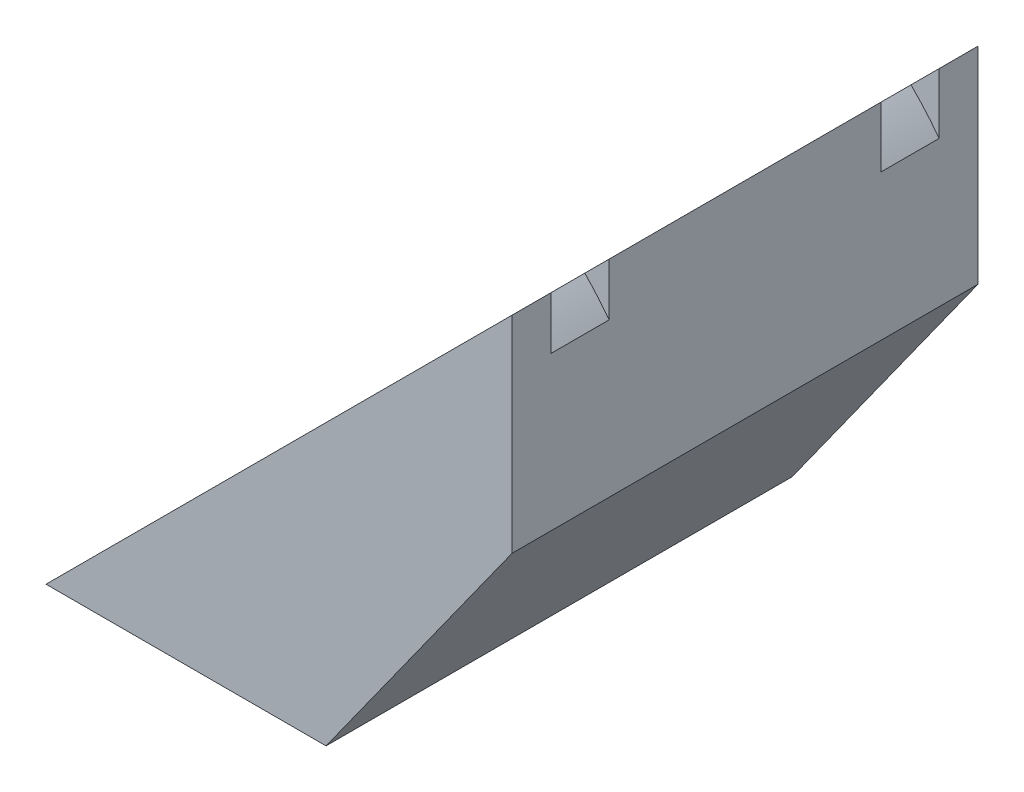
ISO-10303-21;
HEADER;
FILE_DESCRIPTION(('STEP AP214'),'2;1');
FILE_NAME('part.step','',(''),(''),'','','');
FILE_SCHEMA(('AUTOMOTIVE_DESIGN { 1 0 10303 214 1 1 1 1 }'));
ENDSEC;
DATA;
#1=APPLICATION_CONTEXT('core data for automotive mechanical design processes');
#2=APPLICATION_PROTOCOL_DEFINITION('international standard','automotive_design',2000,#1);
#3=PRODUCT_CONTEXT('',#1,'mechanical');
#4=PRODUCT('Part','Part','',(#3));
#5=PRODUCT_RELATED_PRODUCT_CATEGORY('part','',(#4));
#6=PRODUCT_DEFINITION_FORMATION('','',#4);
#7=PRODUCT_DEFINITION_CONTEXT('part definition',#1,'design');
#8=PRODUCT_DEFINITION('design','',#6,#7);
#9=PRODUCT_DEFINITION_SHAPE('','',#8);
#10=(LENGTH_UNIT() NAMED_UNIT(*) SI_UNIT(.MILLI.,.METRE.));
#11=(NAMED_UNIT(*) PLANE_ANGLE_UNIT() SI_UNIT($,.RADIAN.));
#12=(NAMED_UNIT(*) SI_UNIT($,.STERADIAN.) SOLID_ANGLE_UNIT());
#13=UNCERTAINTY_MEASURE_WITH_UNIT(LENGTH_MEASURE(1.E-05),#10,'distance_accuracy_value','');
#14=(GEOMETRIC_REPRESENTATION_CONTEXT(3) GLOBAL_UNCERTAINTY_ASSIGNED_CONTEXT((#13)) GLOBAL_UNIT_ASSIGNED_CONTEXT((#10,
#11,#12)) REPRESENTATION_CONTEXT('',''));
#15=CARTESIAN_POINT('',(0.,0.,0.));
#16=DIRECTION('',(0.,0.,1.));
#17=DIRECTION('',(1.,0.,0.));
#18=AXIS2_PLACEMENT_3D('',#15,#16,#17);
#19=CARTESIAN_POINT('',(12.,24.,-12.));
#20=DIRECTION('',(-1.,0.,0.));
#21=DIRECTION('',(0.,0.,1.));
#22=AXIS2_PLACEMENT_3D('',#19,#20,#21);
#23=PLANE('',#22);
#24=DIRECTION('',(0.,0.,1.));
#25=VECTOR('',#24,1.);
#26=CARTESIAN_POINT('',(12.,13.377330609492,-12.));
#27=LINE('',#26,#25);
#28=CARTESIAN_POINT('',(12.,13.377330609492,-12.));
#29=VERTEX_POINT('',#28);
#30=CARTESIAN_POINT('',(12.,13.377330609492,12.));
#31=VERTEX_POINT('',#30);
#32=EDGE_CURVE('E48',#29,#31,#27,.T.);
#33=ORIENTED_EDGE('',*,*,#32,.F.);
#34=DIRECTION('',(0.,-1.,0.));
#35=VECTOR('',#34,1.);
#36=CARTESIAN_POINT('',(12.,24.,-12.));
#37=LINE('',#36,#35);
#38=CARTESIAN_POINT('',(12.,24.,-12.));
#39=VERTEX_POINT('',#38);
#40=EDGE_CURVE('E250',#39,#29,#37,.T.);
#41=ORIENTED_EDGE('',*,*,#40,.F.);
#42=DIRECTION('',(0.,0.,-1.));
#43=VECTOR('',#42,1.);
#44=CARTESIAN_POINT('',(12.,24.,-12.));
#45=LINE('',#44,#43);
#46=CARTESIAN_POINT('',(12.,24.,-10.));
#47=VERTEX_POINT('',#46);
#48=EDGE_CURVE('E236',#47,#39,#45,.T.);
#49=ORIENTED_EDGE('',*,*,#48,.F.);
#50=DIRECTION('',(0.,1.,0.));
#51=VECTOR('',#50,1.);
#52=CARTESIAN_POINT('',(12.,24.,-10.));
#53=LINE('',#52,#51);
#54=CARTESIAN_POINT('',(12.,20.8850102409347,-10.));
#55=VERTEX_POINT('',#54);
#56=EDGE_CURVE('E373',#55,#47,#53,.T.);
#57=ORIENTED_EDGE('',*,*,#56,.F.);
#58=DIRECTION('',(0.,0.,-1.));
#59=VECTOR('',#58,1.);
#60=CARTESIAN_POINT('',(12.,20.8850102409347,-7.));
#61=LINE('',#60,#59);
#62=CARTESIAN_POINT('',(12.,20.8850102409347,-7.));
#63=VERTEX_POINT('',#62);
#64=EDGE_CURVE('E363',#55,#63,#61,.F.);
#65=ORIENTED_EDGE('',*,*,#64,.T.);
#66=DIRECTION('',(0.,1.,0.));
#67=VECTOR('',#66,1.);
#68=CARTESIAN_POINT('',(12.,24.,-7.));
#69=LINE('',#68,#67);
#70=CARTESIAN_POINT('',(12.,24.,-7.));
#71=VERTEX_POINT('',#70);
#72=EDGE_CURVE('E361',#63,#71,#69,.T.);
#73=ORIENTED_EDGE('',*,*,#72,.T.);
#74=CARTESIAN_POINT('',(12.,24.,7.));
#75=VERTEX_POINT('',#74);
#76=EDGE_CURVE('E239',#75,#71,#45,.T.);
#77=ORIENTED_EDGE('',*,*,#76,.F.);
#78=DIRECTION('',(0.,1.,0.));
#79=VECTOR('',#78,1.);
#80=CARTESIAN_POINT('',(12.,24.,7.));
#81=LINE('',#80,#79);
#82=CARTESIAN_POINT('',(12.,21.2889293337778,7.));
#83=VERTEX_POINT('',#82);
#84=EDGE_CURVE('E359',#83,#75,#81,.T.);
#85=ORIENTED_EDGE('',*,*,#84,.F.);
#86=DIRECTION('',(0.,0.,1.));
#87=VECTOR('',#86,1.);
#88=CARTESIAN_POINT('',(12.,21.2889293337778,7.));
#89=LINE('',#88,#87);
#90=CARTESIAN_POINT('',(12.,21.2889293337778,10.));
#91=VERTEX_POINT('',#90);
#92=EDGE_CURVE('E385',#91,#83,#89,.F.);
#93=ORIENTED_EDGE('',*,*,#92,.F.);
#94=DIRECTION('',(0.,1.,0.));
#95=VECTOR('',#94,1.);
#96=CARTESIAN_POINT('',(12.,24.,10.));
#97=LINE('',#96,#95);
#98=CARTESIAN_POINT('',(12.,24.,10.));
#99=VERTEX_POINT('',#98);
#100=EDGE_CURVE('E387',#91,#99,#97,.T.);
#101=ORIENTED_EDGE('',*,*,#100,.T.);
#102=CARTESIAN_POINT('',(12.,24.,12.));
#103=VERTEX_POINT('',#102);
#104=EDGE_CURVE('E241',#103,#99,#45,.T.);
#105=ORIENTED_EDGE('',*,*,#104,.F.);
#106=DIRECTION('',(0.,-1.,0.));
#107=VECTOR('',#106,1.);
#108=CARTESIAN_POINT('',(12.,24.,12.));
#109=LINE('',#108,#107);
#110=EDGE_CURVE('E248',#103,#31,#109,.T.);
#111=ORIENTED_EDGE('',*,*,#110,.T.);
#112=EDGE_LOOP('',(#33,#41,#49,#57,#65,#73,#77,#85,#93,#101,#105,#111));
#113=FACE_BOUND('',#112,.T.);
#114=ADVANCED_FACE('F35',(#113),#23,.F.);
#115=CARTESIAN_POINT('',(0.,0.,0.));
#116=DIRECTION('',(0.,1.,0.));
#117=DIRECTION('',(0.,0.,1.));
#118=AXIS2_PLACEMENT_3D('',#115,#116,#117);
#119=PLANE('',#118);
#120=DIRECTION('',(-1.,0.,0.));
#121=VECTOR('',#120,1.);
#122=CARTESIAN_POINT('',(0.,0.,4.03680359312908));
#123=LINE('',#122,#121);
#124=CARTESIAN_POINT('',(0.1,0.,4.03680359312908));
#125=VERTEX_POINT('',#124);
#126=CARTESIAN_POINT('',(-0.1,0.,4.03680359312908));
#127=VERTEX_POINT('',#126);
#128=EDGE_CURVE('E42',#125,#127,#123,.T.);
#129=ORIENTED_EDGE('',*,*,#128,.F.);
#130=DIRECTION('',(0.,0.,-1.));
#131=VECTOR('',#130,1.);
#132=CARTESIAN_POINT('',(0.1,0.,0.));
#133=LINE('',#132,#131);
#134=CARTESIAN_POINT('',(0.1,0.,1.19582607431014));
#135=VERTEX_POINT('',#134);
#136=EDGE_CURVE('E499',#125,#135,#133,.T.);
#137=ORIENTED_EDGE('',*,*,#136,.T.);
#138=CARTESIAN_POINT('',(0.,0.,0.));
#139=DIRECTION('',(0.,1.,0.));
#140=DIRECTION('',(0.,0.,1.));
#141=AXIS2_PLACEMENT_3D('',#138,#139,#140);
#142=CIRCLE('',#141,1.2);
#143=CARTESIAN_POINT('',(0.1,0.,-1.19582607431014));
#144=VERTEX_POINT('',#143);
#145=EDGE_CURVE('E497',#135,#144,#142,.T.);
#146=ORIENTED_EDGE('',*,*,#145,.T.);
#147=CARTESIAN_POINT('',(0.1,0.,-4.03680359312908));
#148=VERTEX_POINT('',#147);
#149=EDGE_CURVE('E305',#144,#148,#133,.T.);
#150=ORIENTED_EDGE('',*,*,#149,.T.);
#151=DIRECTION('',(1.,0.,0.));
#152=VECTOR('',#151,1.);
#153=CARTESIAN_POINT('',(0.,0.,-4.03680359312908));
#154=LINE('',#153,#152);
#155=CARTESIAN_POINT('',(-0.1,0.,-4.03680359312908));
#156=VERTEX_POINT('',#155);
#157=EDGE_CURVE('E278',#156,#148,#154,.T.);
#158=ORIENTED_EDGE('',*,*,#157,.F.);
#159=DIRECTION('',(0.,0.,-1.));
#160=VECTOR('',#159,1.);
#161=CARTESIAN_POINT('',(-0.1,0.,0.));
#162=LINE('',#161,#160);
#163=CARTESIAN_POINT('',(-0.1,0.,-1.19582607431014));
#164=VERTEX_POINT('',#163);
#165=EDGE_CURVE('E304',#164,#156,#162,.T.);
#166=ORIENTED_EDGE('',*,*,#165,.F.);
#167=CARTESIAN_POINT('',(-0.1,0.,1.19582607431014));
#168=VERTEX_POINT('',#167);
#169=EDGE_CURVE('E300',#164,#168,#142,.T.);
#170=ORIENTED_EDGE('',*,*,#169,.T.);
#171=EDGE_CURVE('E56',#127,#168,#162,.T.);
#172=ORIENTED_EDGE('',*,*,#171,.F.);
#173=EDGE_LOOP('',(#129,#137,#146,#150,#158,#166,#170,#172));
#174=FACE_BOUND('',#173,.T.);
#175=DIRECTION('',(0.,0.,-1.));
#176=VECTOR('',#175,1.);
#177=CARTESIAN_POINT('',(2.4226441744241,0.,0.));
#178=LINE('',#177,#176);
#179=CARTESIAN_POINT('',(2.4226441744241,0.,12.));
#180=VERTEX_POINT('',#179);
#181=CARTESIAN_POINT('',(2.4226441744241,0.,-12.));
#182=VERTEX_POINT('',#181);
#183=EDGE_CURVE('E218',#180,#182,#178,.T.);
#184=ORIENTED_EDGE('',*,*,#183,.F.);
#185=DIRECTION('',(1.,0.,0.));
#186=VECTOR('',#185,1.);
#187=CARTESIAN_POINT('',(-12.,0.,12.));
#188=LINE('',#187,#186);
#189=CARTESIAN_POINT('',(-12.,0.,12.));
#190=VERTEX_POINT('',#189);
#191=EDGE_CURVE('E229',#190,#180,#188,.T.);
#192=ORIENTED_EDGE('',*,*,#191,.F.);
#193=DIRECTION('',(0.,0.,1.));
#194=VECTOR('',#193,1.);
#195=CARTESIAN_POINT('',(-12.,0.,-12.));
#196=LINE('',#195,#194);
#197=CARTESIAN_POINT('',(-12.,0.,10.));
#198=VERTEX_POINT('',#197);
#199=EDGE_CURVE('E245',#198,#190,#196,.T.);
#200=ORIENTED_EDGE('',*,*,#199,.F.);
#201=DIRECTION('',(1.,0.,0.));
#202=VECTOR('',#201,1.);
#203=CARTESIAN_POINT('',(0.,0.,10.));
#204=LINE('',#203,#202);
#205=CARTESIAN_POINT('',(-8.601291521011,0.,10.));
#206=VERTEX_POINT('',#205);
#207=EDGE_CURVE('E390',#198,#206,#204,.T.);
#208=ORIENTED_EDGE('',*,*,#207,.T.);
#209=DIRECTION('',(0.,0.,1.));
#210=VECTOR('',#209,1.);
#211=CARTESIAN_POINT('',(-8.601291521011,0.,7.));
#212=LINE('',#211,#210);
#213=CARTESIAN_POINT('',(-8.601291521011,0.,7.));
#214=VERTEX_POINT('',#213);
#215=EDGE_CURVE('E379',#214,#206,#212,.T.);
#216=ORIENTED_EDGE('',*,*,#215,.F.);
#217=DIRECTION('',(1.,0.,0.));
#218=VECTOR('',#217,1.);
#219=CARTESIAN_POINT('',(0.,0.,7.));
#220=LINE('',#219,#218);
#221=CARTESIAN_POINT('',(-12.,0.,7.));
#222=VERTEX_POINT('',#221);
#223=EDGE_CURVE('E394',#222,#214,#220,.T.);
#224=ORIENTED_EDGE('',*,*,#223,.F.);
#225=CARTESIAN_POINT('',(-12.,0.,-7.));
#226=VERTEX_POINT('',#225);
#227=EDGE_CURVE('E243',#226,#222,#196,.T.);
#228=ORIENTED_EDGE('',*,*,#227,.F.);
#229=DIRECTION('',(1.,0.,0.));
#230=VECTOR('',#229,1.);
#231=CARTESIAN_POINT('',(0.,0.,-7.));
#232=LINE('',#231,#230);
#233=CARTESIAN_POINT('',(-9.15131310648245,0.,-7.));
#234=VERTEX_POINT('',#233);
#235=EDGE_CURVE('E367',#226,#234,#232,.T.);
#236=ORIENTED_EDGE('',*,*,#235,.T.);
#237=DIRECTION('',(0.,0.,-1.));
#238=VECTOR('',#237,1.);
#239=CARTESIAN_POINT('',(-9.15131310648245,0.,-7.));
#240=LINE('',#239,#238);
#241=CARTESIAN_POINT('',(-9.15131310648245,0.,-10.));
#242=VERTEX_POINT('',#241);
#243=EDGE_CURVE('E513',#234,#242,#240,.T.);
#244=ORIENTED_EDGE('',*,*,#243,.T.);
#245=DIRECTION('',(1.,0.,0.));
#246=VECTOR('',#245,1.);
#247=CARTESIAN_POINT('',(0.,0.,-10.));
#248=LINE('',#247,#246);
#249=CARTESIAN_POINT('',(-12.,0.,-10.));
#250=VERTEX_POINT('',#249);
#251=EDGE_CURVE('E368',#250,#242,#248,.T.);
#252=ORIENTED_EDGE('',*,*,#251,.F.);
#253=CARTESIAN_POINT('',(-12.,0.,-12.));
#254=VERTEX_POINT('',#253);
#255=EDGE_CURVE('E237',#254,#250,#196,.T.);
#256=ORIENTED_EDGE('',*,*,#255,.F.);
#257=DIRECTION('',(-1.,0.,0.));
#258=VECTOR('',#257,1.);
#259=CARTESIAN_POINT('',(-12.,0.,-12.));
#260=LINE('',#259,#258);
#261=EDGE_CURVE('E231',#182,#254,#260,.T.);
#262=ORIENTED_EDGE('',*,*,#261,.F.);
#263=EDGE_LOOP('',(#184,#192,#200,#208,#216,#224,#228,#236,#244,#252,#256,#262));
#264=FACE_BOUND('',#263,.T.);
#265=ADVANCED_FACE('F227',(#174,#264),#119,.F.);
#266=CARTESIAN_POINT('',(-12.,24.,-12.));
#267=DIRECTION('',(0.,0.,1.));
#268=DIRECTION('',(1.,0.,0.));
#269=AXIS2_PLACEMENT_3D('',#266,#267,#268);
#270=PLANE('',#269);
#271=DIRECTION('',(0.582128104236567,0.813097085382761,0.));
#272=VECTOR('',#271,1.);
#273=CARTESIAN_POINT('',(8.8950375608604,9.04042282044391,-12.));
#274=LINE('',#273,#272);
#275=EDGE_CURVE('E295',#182,#29,#274,.T.);
#276=ORIENTED_EDGE('',*,*,#275,.F.);
#277=ORIENTED_EDGE('',*,*,#261,.T.);
#278=DIRECTION('',(-0.707106781186548,-0.707106781186547,0.));
#279=VECTOR('',#278,1.);
#280=CARTESIAN_POINT('',(0.,12.,-12.));
#281=LINE('',#280,#279);
#282=EDGE_CURVE('E341',#39,#254,#281,.T.);
#283=ORIENTED_EDGE('',*,*,#282,.F.);
#284=ORIENTED_EDGE('',*,*,#40,.T.);
#285=EDGE_LOOP('',(#276,#277,#283,#284));
#286=FACE_BOUND('',#285,.T.);
#287=ADVANCED_FACE('F339',(#286),#270,.F.);
#288=CARTESIAN_POINT('',(-12.,24.,12.));
#289=DIRECTION('',(0.,0.,-1.));
#290=DIRECTION('',(-1.,0.,0.));
#291=AXIS2_PLACEMENT_3D('',#288,#289,#290);
#292=PLANE('',#291);
#293=DIRECTION('',(-0.582128104236567,-0.813097085382761,0.));
#294=VECTOR('',#293,1.);
#295=CARTESIAN_POINT('',(8.8950375608604,9.04042282044392,12.));
#296=LINE('',#295,#294);
#297=EDGE_CURVE('E11',#31,#180,#296,.T.);
#298=ORIENTED_EDGE('',*,*,#297,.F.);
#299=ORIENTED_EDGE('',*,*,#110,.F.);
#300=DIRECTION('',(0.707106781186548,0.707106781186547,0.));
#301=VECTOR('',#300,1.);
#302=CARTESIAN_POINT('',(0.,12.,12.));
#303=LINE('',#302,#301);
#304=EDGE_CURVE('E235',#190,#103,#303,.T.);
#305=ORIENTED_EDGE('',*,*,#304,.F.);
#306=ORIENTED_EDGE('',*,*,#191,.T.);
#307=EDGE_LOOP('',(#298,#299,#305,#306));
#308=FACE_BOUND('',#307,.T.);
#309=ADVANCED_FACE('F234',(#308),#292,.F.);
#310=CARTESIAN_POINT('',(0.,8.,0.));
#311=DIRECTION('',(0.,-1.,0.));
#312=DIRECTION('',(0.,0.,-1.));
#313=AXIS2_PLACEMENT_3D('',#310,#311,#312);
#314=CYLINDRICAL_SURFACE('',#313,1.2);
#315=CARTESIAN_POINT('',(0.,8.,0.));
#316=DIRECTION('',(0.,1.,0.));
#317=DIRECTION('',(0.,0.,1.));
#318=AXIS2_PLACEMENT_3D('',#315,#316,#317);
#319=CIRCLE('',#318,1.2);
#320=CARTESIAN_POINT('',(-0.1,8.,-1.19582607431014));
#321=VERTEX_POINT('',#320);
#322=CARTESIAN_POINT('',(-0.1,8.,1.19582607431014));
#323=VERTEX_POINT('',#322);
#324=EDGE_CURVE('E504',#321,#323,#319,.T.);
#325=ORIENTED_EDGE('',*,*,#324,.T.);
#326=DIRECTION('',(0.,-1.,0.));
#327=VECTOR('',#326,1.);
#328=CARTESIAN_POINT('',(-0.1,8.,1.19582607431014));
#329=LINE('',#328,#327);
#330=EDGE_CURVE('E302',#323,#168,#329,.T.);
#331=ORIENTED_EDGE('',*,*,#330,.T.);
#332=ORIENTED_EDGE('',*,*,#169,.F.);
#333=DIRECTION('',(0.,-1.,0.));
#334=VECTOR('',#333,1.);
#335=CARTESIAN_POINT('',(-0.1,8.,-1.19582607431014));
#336=LINE('',#335,#334);
#337=EDGE_CURVE('E309',#164,#321,#336,.F.);
#338=ORIENTED_EDGE('',*,*,#337,.T.);
#339=EDGE_LOOP('',(#325,#331,#332,#338));
#340=FACE_BOUND('',#339,.T.);
#341=ADVANCED_FACE('F464',(#340),#314,.F.);
#342=CARTESIAN_POINT('',(-6.,6.,0.));
#343=DIRECTION('',(-0.707106781186547,0.707106781186548,0.));
#344=DIRECTION('',(-0.707106781186548,-0.707106781186547,0.));
#345=AXIS2_PLACEMENT_3D('',#342,#343,#344);
#346=PLANE('',#345);
#347=DIRECTION('',(0.707106781186548,0.707106781186547,0.));
#348=VECTOR('',#347,1.);
#349=CARTESIAN_POINT('',(-6.,6.,-7.));
#350=LINE('',#349,#348);
#351=CARTESIAN_POINT('',(10.5489510067587,22.5489510067587,-7.));
#352=VERTEX_POINT('',#351);
#353=EDGE_CURVE('E276',#352,#71,#350,.T.);
#354=ORIENTED_EDGE('',*,*,#353,.F.);
#355=DIRECTION('',(0.,0.,-1.));
#356=VECTOR('',#355,1.);
#357=CARTESIAN_POINT('',(10.5489510067587,22.5489510067587,-7.));
#358=LINE('',#357,#356);
#359=CARTESIAN_POINT('',(10.5489510067587,22.5489510067587,-10.));
#360=VERTEX_POINT('',#359);
#361=EDGE_CURVE('E275',#360,#352,#358,.F.);
#362=ORIENTED_EDGE('',*,*,#361,.F.);
#363=DIRECTION('',(0.707106781186548,0.707106781186547,0.));
#364=VECTOR('',#363,1.);
#365=CARTESIAN_POINT('',(-6.,6.,-10.));
#366=LINE('',#365,#364);
#367=EDGE_CURVE('E272',#360,#47,#366,.T.);
#368=ORIENTED_EDGE('',*,*,#367,.T.);
#369=ORIENTED_EDGE('',*,*,#48,.T.);
#370=ORIENTED_EDGE('',*,*,#282,.T.);
#371=ORIENTED_EDGE('',*,*,#255,.T.);
#372=CARTESIAN_POINT('',(-10.663940765824,1.33605923417596,-10.));
#373=VERTEX_POINT('',#372);
#374=EDGE_CURVE('E268',#250,#373,#366,.T.);
#375=ORIENTED_EDGE('',*,*,#374,.T.);
#376=DIRECTION('',(0.,0.,-1.));
#377=VECTOR('',#376,1.);
#378=CARTESIAN_POINT('',(-10.663940765824,1.33605923417596,-7.));
#379=LINE('',#378,#377);
#380=CARTESIAN_POINT('',(-10.663940765824,1.33605923417596,-7.));
#381=VERTEX_POINT('',#380);
#382=EDGE_CURVE('E266',#381,#373,#379,.T.);
#383=ORIENTED_EDGE('',*,*,#382,.F.);
#384=EDGE_CURVE('E271',#226,#381,#350,.T.);
#385=ORIENTED_EDGE('',*,*,#384,.F.);
#386=ORIENTED_EDGE('',*,*,#227,.T.);
#387=DIRECTION('',(0.707106781186548,0.707106781186547,0.));
#388=VECTOR('',#387,1.);
#389=CARTESIAN_POINT('',(-6.,6.,7.));
#390=LINE('',#389,#388);
#391=CARTESIAN_POINT('',(-10.4611531821579,1.53884681784207,7.));
#392=VERTEX_POINT('',#391);
#393=EDGE_CURVE('E263',#222,#392,#390,.T.);
#394=ORIENTED_EDGE('',*,*,#393,.T.);
#395=DIRECTION('',(0.,0.,1.));
#396=VECTOR('',#395,1.);
#397=CARTESIAN_POINT('',(-10.4611531821579,1.53884681784207,7.));
#398=LINE('',#397,#396);
#399=CARTESIAN_POINT('',(-10.4611531821579,1.53884681784207,10.));
#400=VERTEX_POINT('',#399);
#401=EDGE_CURVE('E262',#392,#400,#398,.T.);
#402=ORIENTED_EDGE('',*,*,#401,.T.);
#403=DIRECTION('',(0.707106781186548,0.707106781186547,0.));
#404=VECTOR('',#403,1.);
#405=CARTESIAN_POINT('',(-6.,6.,10.));
#406=LINE('',#405,#404);
#407=EDGE_CURVE('E259',#198,#400,#406,.T.);
#408=ORIENTED_EDGE('',*,*,#407,.F.);
#409=ORIENTED_EDGE('',*,*,#199,.T.);
#410=ORIENTED_EDGE('',*,*,#304,.T.);
#411=ORIENTED_EDGE('',*,*,#104,.T.);
#412=CARTESIAN_POINT('',(10.7500825159357,22.7500825159357,10.));
#413=VERTEX_POINT('',#412);
#414=EDGE_CURVE('E256',#413,#99,#406,.T.);
#415=ORIENTED_EDGE('',*,*,#414,.F.);
#416=DIRECTION('',(0.,0.,1.));
#417=VECTOR('',#416,1.);
#418=CARTESIAN_POINT('',(10.7500825159357,22.7500825159357,7.));
#419=LINE('',#418,#417);
#420=CARTESIAN_POINT('',(10.7500825159357,22.7500825159357,7.));
#421=VERTEX_POINT('',#420);
#422=EDGE_CURVE('E253',#413,#421,#419,.F.);
#423=ORIENTED_EDGE('',*,*,#422,.T.);
#424=EDGE_CURVE('E258',#421,#75,#390,.T.);
#425=ORIENTED_EDGE('',*,*,#424,.T.);
#426=ORIENTED_EDGE('',*,*,#76,.T.);
#427=EDGE_LOOP('',(#354,#362,#368,#369,#370,#371,#375,#383,#385,#386,#394,#402,#408,#409,#410,
#411,#415,#423,#425,#426));
#428=FACE_BOUND('',#427,.T.);
#429=DIRECTION('',(0.,0.,1.));
#430=VECTOR('',#429,1.);
#431=CARTESIAN_POINT('',(-6.75286976033154,5.24713023966847,-9.55000000000001));
#432=LINE('',#431,#430);
#433=CARTESIAN_POINT('',(-6.75286976033154,5.24713023966847,-9.55000000000001));
#434=VERTEX_POINT('',#433);
#435=CARTESIAN_POINT('',(-6.75286976033154,5.24713023966847,9.54999999999999));
#436=VERTEX_POINT('',#435);
#437=EDGE_CURVE('E396',#434,#436,#432,.T.);
#438=ORIENTED_EDGE('',*,*,#437,.F.);
#439=DIRECTION('',(-0.707106781186547,-0.707106781186547,0.));
#440=VECTOR('',#439,1.);
#441=CARTESIAN_POINT('',(6.75286976033152,18.7528697603315,-9.55000000000001));
#442=LINE('',#441,#440);
#443=CARTESIAN_POINT('',(6.75286976033152,18.7528697603315,-9.55000000000001));
#444=VERTEX_POINT('',#443);
#445=EDGE_CURVE('E401',#444,#434,#442,.T.);
#446=ORIENTED_EDGE('',*,*,#445,.F.);
#447=DIRECTION('',(0.,0.,-1.));
#448=VECTOR('',#447,1.);
#449=CARTESIAN_POINT('',(6.75286976033152,18.7528697603315,-9.55000000000001));
#450=LINE('',#449,#448);
#451=CARTESIAN_POINT('',(6.75286976033152,18.7528697603315,9.54999999999999));
#452=VERTEX_POINT('',#451);
#453=EDGE_CURVE('E415',#452,#444,#450,.T.);
#454=ORIENTED_EDGE('',*,*,#453,.F.);
#455=DIRECTION('',(0.707106781186548,0.707106781186548,0.));
#456=VECTOR('',#455,1.);
#457=CARTESIAN_POINT('',(6.75286976033152,18.7528697603315,9.54999999999999));
#458=LINE('',#457,#456);
#459=EDGE_CURVE('E412',#436,#452,#458,.T.);
#460=ORIENTED_EDGE('',*,*,#459,.F.);
#461=EDGE_LOOP('',(#438,#446,#454,#460));
#462=FACE_BOUND('',#461,.T.);
#463=ADVANCED_FACE('F352',(#428,#462),#346,.T.);
#464=CARTESIAN_POINT('',(-6.22253967444163,4.71680015377856,-9.55000000000001));
#465=DIRECTION('',(-0.707106781186547,-0.707106781186547,0.));
#466=DIRECTION('',(0.707106781186548,-0.707106781186548,0.));
#467=AXIS2_PLACEMENT_3D('',#464,#465,#466);
#468=PLANE('',#467);
#469=ORIENTED_EDGE('',*,*,#437,.T.);
#470=DIRECTION('',(-0.707106781186547,0.707106781186547,0.));
#471=VECTOR('',#470,1.);
#472=CARTESIAN_POINT('',(-6.22253967444163,4.71680015377856,9.54999999999999));
#473=LINE('',#472,#471);
#474=CARTESIAN_POINT('',(-6.22253967444163,4.71680015377856,9.54999999999999));
#475=VERTEX_POINT('',#474);
#476=EDGE_CURVE('E410',#475,#436,#473,.T.);
#477=ORIENTED_EDGE('',*,*,#476,.F.);
#478=DIRECTION('',(0.,0.,1.));
#479=VECTOR('',#478,1.);
#480=CARTESIAN_POINT('',(-6.22253967444163,4.71680015377856,-9.55000000000001));
#481=LINE('',#480,#479);
#482=CARTESIAN_POINT('',(-6.22253967444163,4.71680015377856,-9.55000000000001));
#483=VERTEX_POINT('',#482);
#484=EDGE_CURVE('E397',#483,#475,#481,.T.);
#485=ORIENTED_EDGE('',*,*,#484,.F.);
#486=DIRECTION('',(-0.707106781186547,0.707106781186547,0.));
#487=VECTOR('',#486,1.);
#488=CARTESIAN_POINT('',(-6.22253967444163,4.71680015377856,-9.55000000000001));
#489=LINE('',#488,#487);
#490=EDGE_CURVE('E344',#483,#434,#489,.T.);
#491=ORIENTED_EDGE('',*,*,#490,.T.);
#492=EDGE_LOOP('',(#469,#477,#485,#491));
#493=FACE_BOUND('',#492,.T.);
#494=ADVANCED_FACE('F440',(#493),#468,.F.);
#495=CARTESIAN_POINT('',(7.28319984622143,18.2225396744416,-9.55000000000001));
#496=DIRECTION('',(0.,0.,-1.));
#497=DIRECTION('',(-1.,0.,0.));
#498=AXIS2_PLACEMENT_3D('',#495,#496,#497);
#499=PLANE('',#498);
#500=ORIENTED_EDGE('',*,*,#445,.T.);
#501=ORIENTED_EDGE('',*,*,#490,.F.);
#502=DIRECTION('',(-0.707106781186547,-0.707106781186547,0.));
#503=VECTOR('',#502,1.);
#504=CARTESIAN_POINT('',(7.28319984622143,18.2225396744416,-9.55000000000001));
#505=LINE('',#504,#503);
#506=CARTESIAN_POINT('',(7.28319984622143,18.2225396744416,-9.55000000000001));
#507=VERTEX_POINT('',#506);
#508=EDGE_CURVE('E407',#507,#483,#505,.T.);
#509=ORIENTED_EDGE('',*,*,#508,.F.);
#510=DIRECTION('',(-0.707106781186547,0.707106781186547,0.));
#511=VECTOR('',#510,1.);
#512=CARTESIAN_POINT('',(7.28319984622143,18.2225396744416,-9.55000000000001));
#513=LINE('',#512,#511);
#514=EDGE_CURVE('E421',#507,#444,#513,.T.);
#515=ORIENTED_EDGE('',*,*,#514,.T.);
#516=EDGE_LOOP('',(#500,#501,#509,#515));
#517=FACE_BOUND('',#516,.T.);
#518=ADVANCED_FACE('F442',(#517),#499,.F.);
#519=CARTESIAN_POINT('',(7.28319984622143,18.2225396744416,-9.55000000000001));
#520=DIRECTION('',(0.707106781186547,0.707106781186547,0.));
#521=DIRECTION('',(-0.707106781186548,0.707106781186548,0.));
#522=AXIS2_PLACEMENT_3D('',#519,#520,#521);
#523=PLANE('',#522);
#524=ORIENTED_EDGE('',*,*,#453,.T.);
#525=ORIENTED_EDGE('',*,*,#514,.F.);
#526=DIRECTION('',(0.,0.,-1.));
#527=VECTOR('',#526,1.);
#528=CARTESIAN_POINT('',(7.28319984622143,18.2225396744416,-9.55000000000001));
#529=LINE('',#528,#527);
#530=CARTESIAN_POINT('',(7.28319984622143,18.2225396744416,9.54999999999999));
#531=VERTEX_POINT('',#530);
#532=EDGE_CURVE('E404',#531,#507,#529,.T.);
#533=ORIENTED_EDGE('',*,*,#532,.F.);
#534=DIRECTION('',(-0.707106781186547,0.707106781186547,0.));
#535=VECTOR('',#534,1.);
#536=CARTESIAN_POINT('',(7.28319984622143,18.2225396744416,9.54999999999999));
#537=LINE('',#536,#535);
#538=EDGE_CURVE('E423',#531,#452,#537,.T.);
#539=ORIENTED_EDGE('',*,*,#538,.T.);
#540=EDGE_LOOP('',(#524,#525,#533,#539));
#541=FACE_BOUND('',#540,.T.);
#542=ADVANCED_FACE('F435',(#541),#523,.F.);
#543=CARTESIAN_POINT('',(7.28319984622143,18.2225396744416,9.54999999999999));
#544=DIRECTION('',(0.,0.,1.));
#545=DIRECTION('',(1.,0.,0.));
#546=AXIS2_PLACEMENT_3D('',#543,#544,#545);
#547=PLANE('',#546);
#548=ORIENTED_EDGE('',*,*,#459,.T.);
#549=ORIENTED_EDGE('',*,*,#538,.F.);
#550=DIRECTION('',(0.707106781186548,0.707106781186548,0.));
#551=VECTOR('',#550,1.);
#552=CARTESIAN_POINT('',(7.28319984622143,18.2225396744416,9.54999999999999));
#553=LINE('',#552,#551);
#554=EDGE_CURVE('E400',#475,#531,#553,.T.);
#555=ORIENTED_EDGE('',*,*,#554,.F.);
#556=ORIENTED_EDGE('',*,*,#476,.T.);
#557=EDGE_LOOP('',(#548,#549,#555,#556));
#558=FACE_BOUND('',#557,.T.);
#559=ADVANCED_FACE('F428',(#558),#547,.F.);
#560=CARTESIAN_POINT('',(-5.46966991411009,5.46966991411009,0.));
#561=DIRECTION('',(0.707106781186548,-0.707106781186548,0.));
#562=DIRECTION('',(0.707106781186548,0.707106781186548,0.));
#563=AXIS2_PLACEMENT_3D('',#560,#561,#562);
#564=PLANE('',#563);
#565=ORIENTED_EDGE('',*,*,#484,.T.);
#566=ORIENTED_EDGE('',*,*,#554,.T.);
#567=ORIENTED_EDGE('',*,*,#532,.T.);
#568=ORIENTED_EDGE('',*,*,#508,.T.);
#569=EDGE_LOOP('',(#565,#566,#567,#568));
#570=FACE_BOUND('',#569,.T.);
#571=ADVANCED_FACE('F439',(#570),#564,.F.);
#572=CARTESIAN_POINT('',(0.,12.2889293337778,7.));
#573=DIRECTION('',(0.,0.,1.));
#574=DIRECTION('',(1.,0.,0.));
#575=AXIS2_PLACEMENT_3D('',#572,#573,#574);
#576=CYLINDRICAL_SURFACE('',#575,15.);
#577=ORIENTED_EDGE('',*,*,#92,.T.);
#578=CARTESIAN_POINT('',(0.,12.2889293337778,7.));
#579=DIRECTION('',(0.,0.,1.));
#580=DIRECTION('',(1.,0.,0.));
#581=AXIS2_PLACEMENT_3D('',#578,#579,#580);
#582=CIRCLE('',#581,15.);
#583=EDGE_CURVE('E377',#83,#421,#582,.T.);
#584=ORIENTED_EDGE('',*,*,#583,.T.);
#585=ORIENTED_EDGE('',*,*,#422,.F.);
#586=CARTESIAN_POINT('',(0.,12.2889293337778,10.));
#587=DIRECTION('',(0.,0.,1.));
#588=DIRECTION('',(1.,0.,0.));
#589=AXIS2_PLACEMENT_3D('',#586,#587,#588);
#590=CIRCLE('',#589,15.);
#591=EDGE_CURVE('E381',#91,#413,#590,.T.);
#592=ORIENTED_EDGE('',*,*,#591,.F.);
#593=EDGE_LOOP('',(#577,#584,#585,#592));
#594=FACE_BOUND('',#593,.T.);
#595=ADVANCED_FACE('F565',(#594),#576,.T.);
#596=CARTESIAN_POINT('',(0.,12.2889293337778,10.));
#597=DIRECTION('',(0.,0.,1.));
#598=DIRECTION('',(1.,0.,0.));
#599=AXIS2_PLACEMENT_3D('',#596,#597,#598);
#600=PLANE('',#599);
#601=ORIENTED_EDGE('',*,*,#591,.T.);
#602=ORIENTED_EDGE('',*,*,#414,.T.);
#603=ORIENTED_EDGE('',*,*,#100,.F.);
#604=EDGE_LOOP('',(#601,#602,#603));
#605=FACE_BOUND('',#604,.T.);
#606=ADVANCED_FACE('F571',(#605),#600,.F.);
#607=CARTESIAN_POINT('',(0.,12.2889293337778,7.));
#608=DIRECTION('',(0.,0.,1.));
#609=DIRECTION('',(1.,0.,0.));
#610=AXIS2_PLACEMENT_3D('',#607,#608,#609);
#611=PLANE('',#610);
#612=ORIENTED_EDGE('',*,*,#84,.T.);
#613=ORIENTED_EDGE('',*,*,#424,.F.);
#614=ORIENTED_EDGE('',*,*,#583,.F.);
#615=EDGE_LOOP('',(#612,#613,#614));
#616=FACE_BOUND('',#615,.T.);
#617=ADVANCED_FACE('F544',(#616),#611,.T.);
#618=ORIENTED_EDGE('',*,*,#215,.T.);
#619=EDGE_CURVE('E371',#400,#206,#590,.T.);
#620=ORIENTED_EDGE('',*,*,#619,.F.);
#621=ORIENTED_EDGE('',*,*,#401,.F.);
#622=EDGE_CURVE('E380',#392,#214,#582,.T.);
#623=ORIENTED_EDGE('',*,*,#622,.T.);
#624=EDGE_LOOP('',(#618,#620,#621,#623));
#625=FACE_BOUND('',#624,.T.);
#626=ADVANCED_FACE('F560',(#625),#576,.T.);
#627=ORIENTED_EDGE('',*,*,#407,.T.);
#628=ORIENTED_EDGE('',*,*,#619,.T.);
#629=ORIENTED_EDGE('',*,*,#207,.F.);
#630=EDGE_LOOP('',(#627,#628,#629));
#631=FACE_BOUND('',#630,.T.);
#632=ADVANCED_FACE('F541',(#631),#600,.F.);
#633=ORIENTED_EDGE('',*,*,#223,.T.);
#634=ORIENTED_EDGE('',*,*,#622,.F.);
#635=ORIENTED_EDGE('',*,*,#393,.F.);
#636=EDGE_LOOP('',(#633,#634,#635));
#637=FACE_BOUND('',#636,.T.);
#638=ADVANCED_FACE('F534',(#637),#611,.T.);
#639=CARTESIAN_POINT('',(0.,11.8850102409347,-7.));
#640=DIRECTION('',(0.,0.,-1.));
#641=DIRECTION('',(-1.,0.,0.));
#642=AXIS2_PLACEMENT_3D('',#639,#640,#641);
#643=CYLINDRICAL_SURFACE('',#642,15.);
#644=CARTESIAN_POINT('',(0.,11.8850102409347,-7.));
#645=DIRECTION('',(0.,0.,1.));
#646=DIRECTION('',(1.,0.,0.));
#647=AXIS2_PLACEMENT_3D('',#644,#645,#646);
#648=CIRCLE('',#647,15.);
#649=EDGE_CURVE('E514',#381,#234,#648,.T.);
#650=ORIENTED_EDGE('',*,*,#649,.F.);
#651=ORIENTED_EDGE('',*,*,#382,.T.);
#652=CARTESIAN_POINT('',(0.,11.8850102409347,-10.));
#653=DIRECTION('',(0.,0.,1.));
#654=DIRECTION('',(1.,0.,0.));
#655=AXIS2_PLACEMENT_3D('',#652,#653,#654);
#656=CIRCLE('',#655,15.);
#657=EDGE_CURVE('E503',#373,#242,#656,.T.);
#658=ORIENTED_EDGE('',*,*,#657,.T.);
#659=ORIENTED_EDGE('',*,*,#243,.F.);
#660=EDGE_LOOP('',(#650,#651,#658,#659));
#661=FACE_BOUND('',#660,.T.);
#662=ADVANCED_FACE('F525',(#661),#643,.T.);
#663=CARTESIAN_POINT('',(0.,11.8850102409347,-10.));
#664=DIRECTION('',(0.,0.,1.));
#665=DIRECTION('',(1.,0.,0.));
#666=AXIS2_PLACEMENT_3D('',#663,#664,#665);
#667=PLANE('',#666);
#668=ORIENTED_EDGE('',*,*,#251,.T.);
#669=ORIENTED_EDGE('',*,*,#657,.F.);
#670=ORIENTED_EDGE('',*,*,#374,.F.);
#671=EDGE_LOOP('',(#668,#669,#670));
#672=FACE_BOUND('',#671,.T.);
#673=ADVANCED_FACE('F531',(#672),#667,.T.);
#674=CARTESIAN_POINT('',(0.,11.8850102409347,-7.));
#675=DIRECTION('',(0.,0.,1.));
#676=DIRECTION('',(1.,0.,0.));
#677=AXIS2_PLACEMENT_3D('',#674,#675,#676);
#678=PLANE('',#677);
#679=ORIENTED_EDGE('',*,*,#384,.T.);
#680=ORIENTED_EDGE('',*,*,#649,.T.);
#681=ORIENTED_EDGE('',*,*,#235,.F.);
#682=EDGE_LOOP('',(#679,#680,#681));
#683=FACE_BOUND('',#682,.T.);
#684=ADVANCED_FACE('F488',(#683),#678,.F.);
#685=EDGE_CURVE('E507',#55,#360,#656,.T.);
#686=ORIENTED_EDGE('',*,*,#685,.T.);
#687=ORIENTED_EDGE('',*,*,#361,.T.);
#688=EDGE_CURVE('E512',#63,#352,#648,.T.);
#689=ORIENTED_EDGE('',*,*,#688,.F.);
#690=ORIENTED_EDGE('',*,*,#64,.F.);
#691=EDGE_LOOP('',(#686,#687,#689,#690));
#692=FACE_BOUND('',#691,.T.);
#693=ADVANCED_FACE('F523',(#692),#643,.T.);
#694=ORIENTED_EDGE('',*,*,#56,.T.);
#695=ORIENTED_EDGE('',*,*,#367,.F.);
#696=ORIENTED_EDGE('',*,*,#685,.F.);
#697=EDGE_LOOP('',(#694,#695,#696));
#698=FACE_BOUND('',#697,.T.);
#699=ADVANCED_FACE('F486',(#698),#667,.T.);
#700=ORIENTED_EDGE('',*,*,#688,.T.);
#701=ORIENTED_EDGE('',*,*,#353,.T.);
#702=ORIENTED_EDGE('',*,*,#72,.F.);
#703=EDGE_LOOP('',(#700,#701,#702));
#704=FACE_BOUND('',#703,.T.);
#705=ADVANCED_FACE('F479',(#704),#678,.F.);
#706=DIRECTION('',(0.,-1.,0.));
#707=VECTOR('',#706,1.);
#708=CARTESIAN_POINT('',(0.1,8.,1.19582607431014));
#709=LINE('',#708,#707);
#710=CARTESIAN_POINT('',(0.1,8.,1.19582607431014));
#711=VERTEX_POINT('',#710);
#712=EDGE_CURVE('E492',#711,#135,#709,.T.);
#713=ORIENTED_EDGE('',*,*,#712,.F.);
#714=CARTESIAN_POINT('',(0.1,8.,-1.19582607431014));
#715=VERTEX_POINT('',#714);
#716=EDGE_CURVE('E495',#711,#715,#319,.T.);
#717=ORIENTED_EDGE('',*,*,#716,.T.);
#718=DIRECTION('',(0.,-1.,0.));
#719=VECTOR('',#718,1.);
#720=CARTESIAN_POINT('',(0.1,8.,-1.19582607431014));
#721=LINE('',#720,#719);
#722=EDGE_CURVE('E301',#144,#715,#721,.F.);
#723=ORIENTED_EDGE('',*,*,#722,.F.);
#724=ORIENTED_EDGE('',*,*,#145,.F.);
#725=EDGE_LOOP('',(#713,#717,#723,#724));
#726=FACE_BOUND('',#725,.T.);
#727=ADVANCED_FACE('F470',(#726),#314,.F.);
#728=CARTESIAN_POINT('',(0.,8.,0.));
#729=DIRECTION('',(0.,1.,0.));
#730=DIRECTION('',(0.,0.,1.));
#731=AXIS2_PLACEMENT_3D('',#728,#729,#730);
#732=PLANE('',#731);
#733=ORIENTED_EDGE('',*,*,#716,.F.);
#734=DIRECTION('',(0.,0.,1.));
#735=VECTOR('',#734,1.);
#736=CARTESIAN_POINT('',(0.1,8.,-4.03680359312908));
#737=LINE('',#736,#735);
#738=CARTESIAN_POINT('',(0.1,8.,4.03680359312908));
#739=VERTEX_POINT('',#738);
#740=EDGE_CURVE('E325',#711,#739,#737,.T.);
#741=ORIENTED_EDGE('',*,*,#740,.T.);
#742=DIRECTION('',(-1.,0.,0.));
#743=VECTOR('',#742,1.);
#744=CARTESIAN_POINT('',(0.1,8.,4.03680359312908));
#745=LINE('',#744,#743);
#746=CARTESIAN_POINT('',(-0.1,8.,4.03680359312908));
#747=VERTEX_POINT('',#746);
#748=EDGE_CURVE('E318',#739,#747,#745,.T.);
#749=ORIENTED_EDGE('',*,*,#748,.T.);
#750=DIRECTION('',(0.,0.,1.));
#751=VECTOR('',#750,1.);
#752=CARTESIAN_POINT('',(-0.1,8.,-4.03680359312908));
#753=LINE('',#752,#751);
#754=EDGE_CURVE('E292',#323,#747,#753,.T.);
#755=ORIENTED_EDGE('',*,*,#754,.F.);
#756=ORIENTED_EDGE('',*,*,#324,.F.);
#757=CARTESIAN_POINT('',(-0.1,8.,-4.03680359312908));
#758=VERTEX_POINT('',#757);
#759=EDGE_CURVE('E329',#758,#321,#753,.T.);
#760=ORIENTED_EDGE('',*,*,#759,.F.);
#761=DIRECTION('',(-1.,0.,0.));
#762=VECTOR('',#761,1.);
#763=CARTESIAN_POINT('',(0.1,8.,-4.03680359312908));
#764=LINE('',#763,#762);
#765=CARTESIAN_POINT('',(0.1,8.,-4.03680359312908));
#766=VERTEX_POINT('',#765);
#767=EDGE_CURVE('E313',#766,#758,#764,.T.);
#768=ORIENTED_EDGE('',*,*,#767,.F.);
#769=EDGE_CURVE('E322',#766,#715,#737,.T.);
#770=ORIENTED_EDGE('',*,*,#769,.T.);
#771=EDGE_LOOP('',(#733,#741,#749,#755,#756,#760,#768,#770));
#772=FACE_BOUND('',#771,.T.);
#773=ADVANCED_FACE('F478',(#772),#732,.F.);
#774=CARTESIAN_POINT('',(0.1,0.,0.));
#775=DIRECTION('',(1.,0.,0.));
#776=DIRECTION('',(0.,0.,-1.));
#777=AXIS2_PLACEMENT_3D('',#774,#775,#776);
#778=PLANE('',#777);
#779=ORIENTED_EDGE('',*,*,#722,.T.);
#780=ORIENTED_EDGE('',*,*,#769,.F.);
#781=DIRECTION('',(0.,1.,0.));
#782=VECTOR('',#781,1.);
#783=CARTESIAN_POINT('',(0.1,-8.,-4.03680359312908));
#784=LINE('',#783,#782);
#785=EDGE_CURVE('E326',#148,#766,#784,.T.);
#786=ORIENTED_EDGE('',*,*,#785,.F.);
#787=ORIENTED_EDGE('',*,*,#149,.F.);
#788=EDGE_LOOP('',(#779,#780,#786,#787));
#789=FACE_BOUND('',#788,.T.);
#790=ADVANCED_FACE('F484',(#789),#778,.F.);
#791=CARTESIAN_POINT('',(-0.1,0.,0.));
#792=DIRECTION('',(1.,0.,0.));
#793=DIRECTION('',(0.,0.,-1.));
#794=AXIS2_PLACEMENT_3D('',#791,#792,#793);
#795=PLANE('',#794);
#796=ORIENTED_EDGE('',*,*,#165,.T.);
#797=DIRECTION('',(0.,1.,0.));
#798=VECTOR('',#797,1.);
#799=CARTESIAN_POINT('',(-0.1,-8.,-4.03680359312908));
#800=LINE('',#799,#798);
#801=EDGE_CURVE('E294',#156,#758,#800,.T.);
#802=ORIENTED_EDGE('',*,*,#801,.T.);
#803=ORIENTED_EDGE('',*,*,#759,.T.);
#804=ORIENTED_EDGE('',*,*,#337,.F.);
#805=EDGE_LOOP('',(#796,#802,#803,#804));
#806=FACE_BOUND('',#805,.T.);
#807=ADVANCED_FACE('F695',(#806),#795,.T.);
#808=CARTESIAN_POINT('',(0.1,-8.,-4.03680359312908));
#809=DIRECTION('',(0.,0.,1.));
#810=DIRECTION('',(0.,-1.,0.));
#811=AXIS2_PLACEMENT_3D('',#808,#809,#810);
#812=PLANE('',#811);
#813=ORIENTED_EDGE('',*,*,#157,.T.);
#814=ORIENTED_EDGE('',*,*,#785,.T.);
#815=ORIENTED_EDGE('',*,*,#767,.T.);
#816=ORIENTED_EDGE('',*,*,#801,.F.);
#817=EDGE_LOOP('',(#813,#814,#815,#816));
#818=FACE_BOUND('',#817,.T.);
#819=ADVANCED_FACE('F705',(#818),#812,.T.);
#820=CARTESIAN_POINT('',(0.1,-8.,4.03680359312908));
#821=DIRECTION('',(0.,0.,-1.));
#822=DIRECTION('',(-1.,0.,0.));
#823=AXIS2_PLACEMENT_3D('',#820,#821,#822);
#824=PLANE('',#823);
#825=ORIENTED_EDGE('',*,*,#128,.T.);
#826=DIRECTION('',(0.,-1.,0.));
#827=VECTOR('',#826,1.);
#828=CARTESIAN_POINT('',(-0.1,-8.,4.03680359312908));
#829=LINE('',#828,#827);
#830=EDGE_CURVE('E285',#747,#127,#829,.T.);
#831=ORIENTED_EDGE('',*,*,#830,.F.);
#832=ORIENTED_EDGE('',*,*,#748,.F.);
#833=DIRECTION('',(0.,-1.,0.));
#834=VECTOR('',#833,1.);
#835=CARTESIAN_POINT('',(0.1,-8.,4.03680359312908));
#836=LINE('',#835,#834);
#837=EDGE_CURVE('E287',#739,#125,#836,.T.);
#838=ORIENTED_EDGE('',*,*,#837,.T.);
#839=EDGE_LOOP('',(#825,#831,#832,#838));
#840=FACE_BOUND('',#839,.T.);
#841=ADVANCED_FACE('F283',(#840),#824,.T.);
#842=ORIENTED_EDGE('',*,*,#837,.F.);
#843=ORIENTED_EDGE('',*,*,#740,.F.);
#844=ORIENTED_EDGE('',*,*,#712,.T.);
#845=ORIENTED_EDGE('',*,*,#136,.F.);
#846=EDGE_LOOP('',(#842,#843,#844,#845));
#847=FACE_BOUND('',#846,.T.);
#848=ADVANCED_FACE('F698',(#847),#778,.F.);
#849=ORIENTED_EDGE('',*,*,#171,.T.);
#850=ORIENTED_EDGE('',*,*,#330,.F.);
#851=ORIENTED_EDGE('',*,*,#754,.T.);
#852=ORIENTED_EDGE('',*,*,#830,.T.);
#853=EDGE_LOOP('',(#849,#850,#851,#852));
#854=FACE_BOUND('',#853,.T.);
#855=ADVANCED_FACE('F290',(#854),#795,.T.);
#856=CARTESIAN_POINT('',(0.926133030944243,-2.09027676236673,15.));
#857=DIRECTION('',(0.813097085382761,-0.582128104236567,0.));
#858=DIRECTION('',(0.582128104236567,0.813097085382761,0.));
#859=AXIS2_PLACEMENT_3D('',#856,#857,#858);
#860=PLANE('',#859);
#861=ORIENTED_EDGE('',*,*,#275,.T.);
#862=ORIENTED_EDGE('',*,*,#32,.T.);
#863=ORIENTED_EDGE('',*,*,#297,.T.);
#864=ORIENTED_EDGE('',*,*,#183,.T.);
#865=EDGE_LOOP('',(#861,#862,#863,#864));
#866=FACE_BOUND('',#865,.T.);
#867=ADVANCED_FACE('F217',(#866),#860,.T.);
#868=CLOSED_SHELL('',(#114,#265,#287,#309,#341,#463,#494,#518,#542,#559,#571,#595,#606,#617,
#626,#632,#638,#662,#673,#684,#693,#699,#705,#727,#773,#790,#807,#819,#841,#848,#855,#867));
#869=MANIFOLD_SOLID_BREP('B2',#868);
#870=ADVANCED_BREP_SHAPE_REPRESENTATION('',(#18,#869),#14);
#871=SHAPE_DEFINITION_REPRESENTATION(#9,#870);
ENDSEC;
END-ISO-10303-21;
